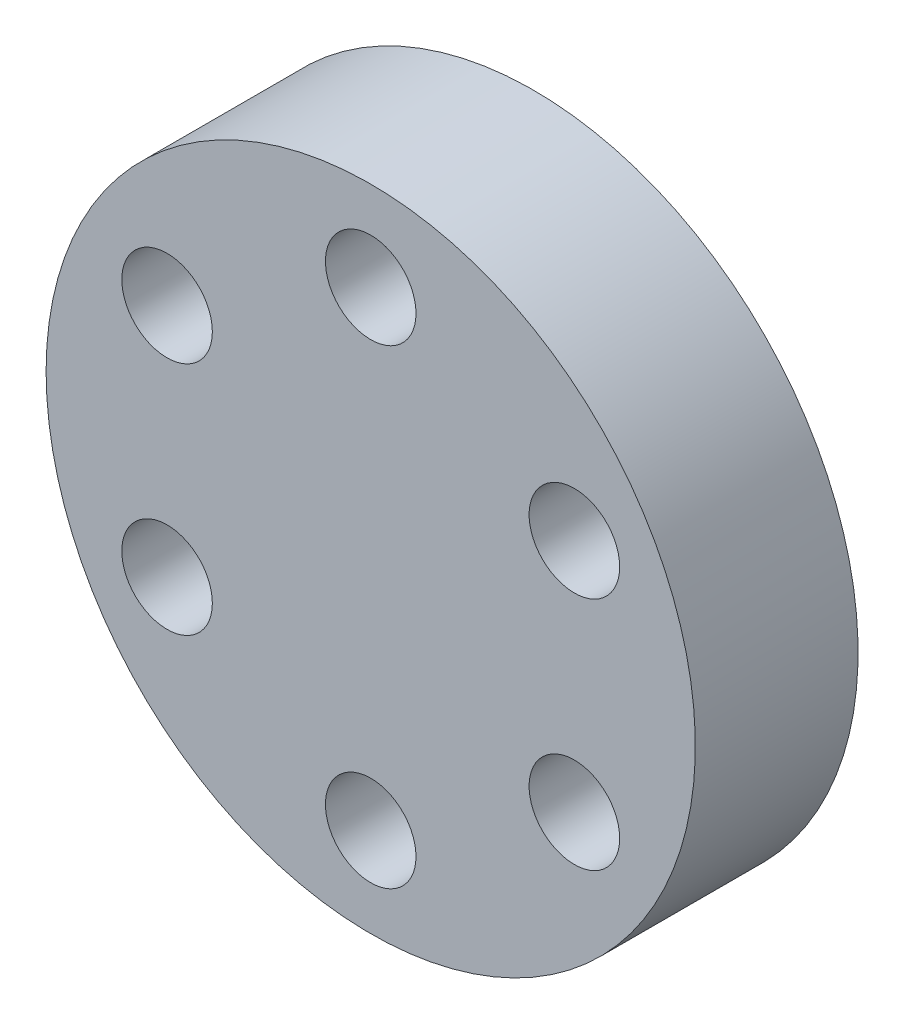
ISO-10303-21;
HEADER;
FILE_DESCRIPTION(('STEP AP214'),'2;1');
FILE_NAME('part.step','',(''),(''),'','','');
FILE_SCHEMA(('AUTOMOTIVE_DESIGN { 1 0 10303 214 1 1 1 1 }'));
ENDSEC;
DATA;
#1=APPLICATION_CONTEXT('core data for automotive mechanical design processes');
#2=APPLICATION_PROTOCOL_DEFINITION('international standard','automotive_design',2000,#1);
#3=PRODUCT_CONTEXT('',#1,'mechanical');
#4=PRODUCT('Part','Part','',(#3));
#5=PRODUCT_RELATED_PRODUCT_CATEGORY('part','',(#4));
#6=PRODUCT_DEFINITION_FORMATION('','',#4);
#7=PRODUCT_DEFINITION_CONTEXT('part definition',#1,'design');
#8=PRODUCT_DEFINITION('design','',#6,#7);
#9=PRODUCT_DEFINITION_SHAPE('','',#8);
#10=(LENGTH_UNIT() NAMED_UNIT(*) SI_UNIT(.MILLI.,.METRE.));
#11=(NAMED_UNIT(*) PLANE_ANGLE_UNIT() SI_UNIT($,.RADIAN.));
#12=(NAMED_UNIT(*) SI_UNIT($,.STERADIAN.) SOLID_ANGLE_UNIT());
#13=UNCERTAINTY_MEASURE_WITH_UNIT(LENGTH_MEASURE(1.E-05),#10,'distance_accuracy_value','');
#14=(GEOMETRIC_REPRESENTATION_CONTEXT(3) GLOBAL_UNCERTAINTY_ASSIGNED_CONTEXT((#13)) GLOBAL_UNIT_ASSIGNED_CONTEXT((#10,
#11,#12)) REPRESENTATION_CONTEXT('',''));
#15=CARTESIAN_POINT('',(0.,0.,0.));
#16=DIRECTION('',(0.,0.,1.));
#17=DIRECTION('',(1.,0.,0.));
#18=AXIS2_PLACEMENT_3D('',#15,#16,#17);
#19=CARTESIAN_POINT('',(0.,0.,9.525));
#20=DIRECTION('',(0.,0.,-1.));
#21=DIRECTION('',(-1.,0.,0.));
#22=AXIS2_PLACEMENT_3D('',#19,#20,#21);
#23=CYLINDRICAL_SURFACE('',#22,19.);
#24=CARTESIAN_POINT('',(0.,0.,9.525));
#25=DIRECTION('',(0.,0.,1.));
#26=DIRECTION('',(1.,0.,0.));
#27=AXIS2_PLACEMENT_3D('',#24,#25,#26);
#28=CIRCLE('',#27,19.);
#29=CARTESIAN_POINT('',(-19.,0.,9.525));
#30=VERTEX_POINT('',#29);
#31=EDGE_CURVE('E10',#30,#30,#28,.T.);
#32=CARTESIAN_POINT('',(0.,0.,0.));
#33=DIRECTION('',(0.,0.,1.));
#34=DIRECTION('',(1.,0.,0.));
#35=AXIS2_PLACEMENT_3D('',#32,#33,#34);
#36=CIRCLE('',#35,19.);
#37=CARTESIAN_POINT('',(-19.,0.,0.));
#38=VERTEX_POINT('',#37);
#39=EDGE_CURVE('E46',#38,#38,#36,.T.);
#40=CARTESIAN_POINT('',(-19.,0.,9.525));
#41=CARTESIAN_POINT('',(-19.,0.,9.42578125));
#42=CARTESIAN_POINT('',(-19.,0.,9.3265625));
#43=CARTESIAN_POINT('',(-19.,0.,9.128125));
#44=CARTESIAN_POINT('',(-19.,0.,9.02890625));
#45=CARTESIAN_POINT('',(-19.,0.,8.83046875));
#46=CARTESIAN_POINT('',(-19.,0.,8.73125));
#47=CARTESIAN_POINT('',(-19.,0.,8.5328125));
#48=CARTESIAN_POINT('',(-19.,0.,8.43359375));
#49=CARTESIAN_POINT('',(-19.,0.,8.23515625));
#50=CARTESIAN_POINT('',(-19.,0.,8.1359375));
#51=CARTESIAN_POINT('',(-19.,0.,7.9375));
#52=CARTESIAN_POINT('',(-19.,0.,7.83828125));
#53=CARTESIAN_POINT('',(-19.,0.,7.63984375));
#54=CARTESIAN_POINT('',(-19.,0.,7.540625));
#55=CARTESIAN_POINT('',(-19.,0.,7.3421875));
#56=CARTESIAN_POINT('',(-19.,0.,7.24296875));
#57=CARTESIAN_POINT('',(-19.,0.,7.04453125));
#58=CARTESIAN_POINT('',(-19.,0.,6.9453125));
#59=CARTESIAN_POINT('',(-19.,0.,6.746875));
#60=CARTESIAN_POINT('',(-19.,0.,6.64765625));
#61=CARTESIAN_POINT('',(-19.,0.,6.44921875));
#62=CARTESIAN_POINT('',(-19.,0.,6.35));
#63=CARTESIAN_POINT('',(-19.,0.,6.1515625));
#64=CARTESIAN_POINT('',(-19.,0.,6.05234375));
#65=CARTESIAN_POINT('',(-19.,0.,5.85390625));
#66=CARTESIAN_POINT('',(-19.,0.,5.7546875));
#67=CARTESIAN_POINT('',(-19.,0.,5.55625));
#68=CARTESIAN_POINT('',(-19.,0.,5.45703125));
#69=CARTESIAN_POINT('',(-19.,0.,5.25859375));
#70=CARTESIAN_POINT('',(-19.,0.,5.159375));
#71=CARTESIAN_POINT('',(-19.,0.,4.9609375));
#72=CARTESIAN_POINT('',(-19.,0.,4.86171875));
#73=CARTESIAN_POINT('',(-19.,0.,4.66328125));
#74=CARTESIAN_POINT('',(-19.,0.,4.5640625));
#75=CARTESIAN_POINT('',(-19.,0.,4.365625));
#76=CARTESIAN_POINT('',(-19.,0.,4.26640625));
#77=CARTESIAN_POINT('',(-19.,0.,4.06796875));
#78=CARTESIAN_POINT('',(-19.,0.,3.96875));
#79=CARTESIAN_POINT('',(-19.,0.,3.7703125));
#80=CARTESIAN_POINT('',(-19.,0.,3.67109375));
#81=CARTESIAN_POINT('',(-19.,0.,3.47265625));
#82=CARTESIAN_POINT('',(-19.,0.,3.3734375));
#83=CARTESIAN_POINT('',(-19.,0.,3.175));
#84=CARTESIAN_POINT('',(-19.,0.,3.07578125));
#85=CARTESIAN_POINT('',(-19.,0.,2.87734375));
#86=CARTESIAN_POINT('',(-19.,0.,2.778125));
#87=CARTESIAN_POINT('',(-19.,0.,2.5796875));
#88=CARTESIAN_POINT('',(-19.,0.,2.48046875));
#89=CARTESIAN_POINT('',(-19.,0.,2.28203125));
#90=CARTESIAN_POINT('',(-19.,0.,2.1828125));
#91=CARTESIAN_POINT('',(-19.,0.,1.984375));
#92=CARTESIAN_POINT('',(-19.,0.,1.88515625));
#93=CARTESIAN_POINT('',(-19.,0.,1.68671875));
#94=CARTESIAN_POINT('',(-19.,0.,1.5875));
#95=CARTESIAN_POINT('',(-19.,0.,1.3890625));
#96=CARTESIAN_POINT('',(-19.,0.,1.28984375));
#97=CARTESIAN_POINT('',(-19.,0.,1.09140625));
#98=CARTESIAN_POINT('',(-19.,0.,0.992187500000001));
#99=CARTESIAN_POINT('',(-19.,0.,0.793750000000001));
#100=CARTESIAN_POINT('',(-19.,0.,0.69453125));
#101=CARTESIAN_POINT('',(-19.,0.,0.49609375));
#102=CARTESIAN_POINT('',(-19.,0.,0.396875));
#103=CARTESIAN_POINT('',(-19.,0.,0.1984375));
#104=CARTESIAN_POINT('',(-19.,0.,0.0992187500000001));
#105=CARTESIAN_POINT('',(-19.,0.,0.));
#106=B_SPLINE_CURVE_WITH_KNOTS('',3,(#40,#41,#42,#43,#44,#45,#46,#47,#48,#49,#50,#51,#52,#53,
#54,#55,#56,#57,#58,#59,#60,#61,#62,#63,#64,#65,#66,#67,#68,#69,#70,#71,#72,#73,#74,#75,#76,#77,
#78,#79,#80,#81,#82,#83,#84,#85,#86,#87,#88,#89,#90,#91,#92,#93,#94,#95,#96,#97,#98,#99,#100,
#101,#102,#103,#104,#105),.UNSPECIFIED.,.F.,.F.,(4,2,2,2,2,2,2,2,2,2,2,2,2,2,2,2,2,2,2,2,2,2,2,
2,2,2,2,2,2,2,2,2,4),(0.,0.29765625,0.5953125,0.892968750000001,1.190625,1.48828125,1.7859375,
2.08359375,2.38125,2.67890625,2.9765625,3.27421875,3.571875,3.86953125,4.1671875,4.46484375,
4.7625,5.06015625,5.3578125,5.65546875,5.953125,6.25078125,6.5484375,6.84609375,7.14375,
7.44140625,7.7390625,8.03671875,8.334375,8.63203125,8.9296875,9.22734375,9.525),.UNSPECIFIED.);
#107=EDGE_CURVE('BSEAM43',#30,#38,#106,.T.);
#108=ORIENTED_EDGE('',*,*,#31,.F.);
#109=ORIENTED_EDGE('',*,*,#39,.T.);
#110=ORIENTED_EDGE('',*,*,#107,.T.);
#111=ORIENTED_EDGE('',*,*,#107,.F.);
#112=EDGE_LOOP('',(#108,#110,#109,#111));
#113=FACE_BOUND('',#112,.T.);
#114=ADVANCED_FACE('F43',(#113),#23,.T.);
#115=CARTESIAN_POINT('',(0.,0.,9.525));
#116=DIRECTION('',(0.,0.,1.));
#117=DIRECTION('',(1.,0.,0.));
#118=AXIS2_PLACEMENT_3D('',#115,#116,#117);
#119=PLANE('',#118);
#120=CARTESIAN_POINT('',(0.,13.7637896242771,9.525));
#121=DIRECTION('',(0.,0.,1.));
#122=DIRECTION('',(1.,0.,0.));
#123=AXIS2_PLACEMENT_3D('',#120,#121,#122);
#124=CIRCLE('',#123,2.64999999999999);
#125=CARTESIAN_POINT('',(2.64999999999999,13.7637896242771,9.525));
#126=VERTEX_POINT('',#125);
#127=EDGE_CURVE('E100',#126,#126,#124,.T.);
#128=ORIENTED_EDGE('',*,*,#127,.F.);
#129=EDGE_LOOP('',(#128));
#130=FACE_BOUND('',#129,.T.);
#131=CARTESIAN_POINT('',(11.9197914669691,6.88189481213925,9.525));
#132=DIRECTION('',(0.,0.,1.));
#133=DIRECTION('',(1.,0.,0.));
#134=AXIS2_PLACEMENT_3D('',#131,#132,#133);
#135=CIRCLE('',#134,2.64999999999999);
#136=CARTESIAN_POINT('',(14.5697914669691,6.88189481213925,9.525));
#137=VERTEX_POINT('',#136);
#138=EDGE_CURVE('E92',#137,#137,#135,.T.);
#139=ORIENTED_EDGE('',*,*,#138,.F.);
#140=EDGE_LOOP('',(#139));
#141=FACE_BOUND('',#140,.T.);
#142=CARTESIAN_POINT('',(11.9197914669699,-6.88189481213789,9.525));
#143=DIRECTION('',(0.,0.,1.));
#144=DIRECTION('',(1.,0.,0.));
#145=AXIS2_PLACEMENT_3D('',#142,#143,#144);
#146=CIRCLE('',#145,2.64999999999999);
#147=CARTESIAN_POINT('',(14.5697914669698,-6.88189481213789,9.525));
#148=VERTEX_POINT('',#147);
#149=EDGE_CURVE('E84',#148,#148,#146,.T.);
#150=ORIENTED_EDGE('',*,*,#149,.F.);
#151=EDGE_LOOP('',(#150));
#152=FACE_BOUND('',#151,.T.);
#153=CARTESIAN_POINT('',(1.55970498317741E-12,-13.7637896242771,9.525));
#154=DIRECTION('',(0.,0.,1.));
#155=DIRECTION('',(1.,0.,0.));
#156=AXIS2_PLACEMENT_3D('',#153,#154,#155);
#157=CIRCLE('',#156,2.64999999999999);
#158=CARTESIAN_POINT('',(2.65000000000155,-13.7637896242771,9.525));
#159=VERTEX_POINT('',#158);
#160=EDGE_CURVE('E76',#159,#159,#157,.T.);
#161=ORIENTED_EDGE('',*,*,#160,.F.);
#162=EDGE_LOOP('',(#161));
#163=FACE_BOUND('',#162,.T.);
#164=CARTESIAN_POINT('',(-11.9197914669675,-6.88189481213925,9.525));
#165=DIRECTION('',(0.,0.,1.));
#166=DIRECTION('',(1.,0.,0.));
#167=AXIS2_PLACEMENT_3D('',#164,#165,#166);
#168=CIRCLE('',#167,2.64999999999999);
#169=CARTESIAN_POINT('',(-9.26979146696752,-6.88189481213925,9.525));
#170=VERTEX_POINT('',#169);
#171=EDGE_CURVE('E68',#170,#170,#168,.T.);
#172=ORIENTED_EDGE('',*,*,#171,.F.);
#173=EDGE_LOOP('',(#172));
#174=FACE_BOUND('',#173,.T.);
#175=CARTESIAN_POINT('',(-11.9197914669683,6.8818948121379,9.525));
#176=DIRECTION('',(0.,0.,1.));
#177=DIRECTION('',(1.,0.,0.));
#178=AXIS2_PLACEMENT_3D('',#175,#176,#177);
#179=CIRCLE('',#178,2.64999999999999);
#180=CARTESIAN_POINT('',(-9.2697914669683,6.8818948121379,9.525));
#181=VERTEX_POINT('',#180);
#182=EDGE_CURVE('E60',#181,#181,#179,.T.);
#183=ORIENTED_EDGE('',*,*,#182,.F.);
#184=EDGE_LOOP('',(#183));
#185=FACE_BOUND('',#184,.T.);
#186=ORIENTED_EDGE('',*,*,#31,.T.);
#187=EDGE_LOOP('',(#186));
#188=FACE_BOUND('',#187,.T.);
#189=ADVANCED_FACE('F107',(#130,#141,#152,#163,#174,#185,#188),#119,.T.);
#190=CARTESIAN_POINT('',(0.,0.,0.));
#191=DIRECTION('',(0.,0.,1.));
#192=DIRECTION('',(1.,0.,0.));
#193=AXIS2_PLACEMENT_3D('',#190,#191,#192);
#194=PLANE('',#193);
#195=CARTESIAN_POINT('',(0.,13.7637896242771,0.));
#196=DIRECTION('',(0.,0.,1.));
#197=DIRECTION('',(1.,0.,0.));
#198=AXIS2_PLACEMENT_3D('',#195,#196,#197);
#199=CIRCLE('',#198,2.65);
#200=CARTESIAN_POINT('',(2.65,13.7637896242771,0.));
#201=VERTEX_POINT('',#200);
#202=EDGE_CURVE('E96',#201,#201,#199,.T.);
#203=ORIENTED_EDGE('',*,*,#202,.T.);
#204=EDGE_LOOP('',(#203));
#205=FACE_BOUND('',#204,.T.);
#206=CARTESIAN_POINT('',(11.9197914669691,6.88189481213925,0.));
#207=DIRECTION('',(0.,0.,1.));
#208=DIRECTION('',(1.,0.,0.));
#209=AXIS2_PLACEMENT_3D('',#206,#207,#208);
#210=CIRCLE('',#209,2.65);
#211=CARTESIAN_POINT('',(14.5697914669691,6.88189481213925,0.));
#212=VERTEX_POINT('',#211);
#213=EDGE_CURVE('E88',#212,#212,#210,.T.);
#214=ORIENTED_EDGE('',*,*,#213,.T.);
#215=EDGE_LOOP('',(#214));
#216=FACE_BOUND('',#215,.T.);
#217=CARTESIAN_POINT('',(11.9197914669699,-6.88189481213789,0.));
#218=DIRECTION('',(0.,0.,1.));
#219=DIRECTION('',(1.,0.,0.));
#220=AXIS2_PLACEMENT_3D('',#217,#218,#219);
#221=CIRCLE('',#220,2.65);
#222=CARTESIAN_POINT('',(14.5697914669698,-6.88189481213789,0.));
#223=VERTEX_POINT('',#222);
#224=EDGE_CURVE('E80',#223,#223,#221,.T.);
#225=ORIENTED_EDGE('',*,*,#224,.T.);
#226=EDGE_LOOP('',(#225));
#227=FACE_BOUND('',#226,.T.);
#228=CARTESIAN_POINT('',(1.55970498317741E-12,-13.7637896242771,0.));
#229=DIRECTION('',(0.,0.,1.));
#230=DIRECTION('',(1.,0.,0.));
#231=AXIS2_PLACEMENT_3D('',#228,#229,#230);
#232=CIRCLE('',#231,2.65);
#233=CARTESIAN_POINT('',(2.65000000000156,-13.7637896242771,0.));
#234=VERTEX_POINT('',#233);
#235=EDGE_CURVE('E72',#234,#234,#232,.T.);
#236=ORIENTED_EDGE('',*,*,#235,.T.);
#237=EDGE_LOOP('',(#236));
#238=FACE_BOUND('',#237,.T.);
#239=CARTESIAN_POINT('',(-11.9197914669675,-6.88189481213925,0.));
#240=DIRECTION('',(0.,0.,1.));
#241=DIRECTION('',(1.,0.,0.));
#242=AXIS2_PLACEMENT_3D('',#239,#240,#241);
#243=CIRCLE('',#242,2.65);
#244=CARTESIAN_POINT('',(-9.26979146696751,-6.88189481213925,0.));
#245=VERTEX_POINT('',#244);
#246=EDGE_CURVE('E64',#245,#245,#243,.T.);
#247=ORIENTED_EDGE('',*,*,#246,.T.);
#248=EDGE_LOOP('',(#247));
#249=FACE_BOUND('',#248,.T.);
#250=CARTESIAN_POINT('',(-11.9197914669683,6.8818948121379,0.));
#251=DIRECTION('',(0.,0.,1.));
#252=DIRECTION('',(1.,0.,0.));
#253=AXIS2_PLACEMENT_3D('',#250,#251,#252);
#254=CIRCLE('',#253,2.65);
#255=CARTESIAN_POINT('',(-9.26979146696829,6.8818948121379,0.));
#256=VERTEX_POINT('',#255);
#257=EDGE_CURVE('E55',#256,#256,#254,.T.);
#258=ORIENTED_EDGE('',*,*,#257,.T.);
#259=EDGE_LOOP('',(#258));
#260=FACE_BOUND('',#259,.T.);
#261=ORIENTED_EDGE('',*,*,#39,.F.);
#262=EDGE_LOOP('',(#261));
#263=FACE_BOUND('',#262,.T.);
#264=ADVANCED_FACE('F110',(#205,#216,#227,#238,#249,#260,#263),#194,.F.);
#265=CARTESIAN_POINT('',(-11.9197914669683,6.8818948121379,9.525));
#266=DIRECTION('',(0.,0.,1.));
#267=DIRECTION('',(1.,0.,0.));
#268=AXIS2_PLACEMENT_3D('',#265,#266,#267);
#269=CYLINDRICAL_SURFACE('',#268,2.64999999999999);
#270=ORIENTED_EDGE('',*,*,#257,.F.);
#271=EDGE_LOOP('',(#270));
#272=FACE_BOUND('',#271,.T.);
#273=ORIENTED_EDGE('',*,*,#182,.T.);
#274=EDGE_LOOP('',(#273));
#275=FACE_BOUND('',#274,.T.);
#276=ADVANCED_FACE('F122',(#272,#275),#269,.F.);
#277=CARTESIAN_POINT('',(-11.9197914669675,-6.88189481213925,9.525));
#278=DIRECTION('',(0.,0.,1.));
#279=DIRECTION('',(1.,0.,0.));
#280=AXIS2_PLACEMENT_3D('',#277,#278,#279);
#281=CYLINDRICAL_SURFACE('',#280,2.64999999999999);
#282=ORIENTED_EDGE('',*,*,#246,.F.);
#283=EDGE_LOOP('',(#282));
#284=FACE_BOUND('',#283,.T.);
#285=ORIENTED_EDGE('',*,*,#171,.T.);
#286=EDGE_LOOP('',(#285));
#287=FACE_BOUND('',#286,.T.);
#288=ADVANCED_FACE('F124',(#284,#287),#281,.F.);
#289=CARTESIAN_POINT('',(1.55970498317741E-12,-13.7637896242771,9.525));
#290=DIRECTION('',(0.,0.,1.));
#291=DIRECTION('',(1.,0.,0.));
#292=AXIS2_PLACEMENT_3D('',#289,#290,#291);
#293=CYLINDRICAL_SURFACE('',#292,2.64999999999999);
#294=ORIENTED_EDGE('',*,*,#235,.F.);
#295=EDGE_LOOP('',(#294));
#296=FACE_BOUND('',#295,.T.);
#297=ORIENTED_EDGE('',*,*,#160,.T.);
#298=EDGE_LOOP('',(#297));
#299=FACE_BOUND('',#298,.T.);
#300=ADVANCED_FACE('F131',(#296,#299),#293,.F.);
#301=CARTESIAN_POINT('',(11.9197914669699,-6.88189481213789,9.525));
#302=DIRECTION('',(0.,0.,1.));
#303=DIRECTION('',(1.,0.,0.));
#304=AXIS2_PLACEMENT_3D('',#301,#302,#303);
#305=CYLINDRICAL_SURFACE('',#304,2.64999999999999);
#306=ORIENTED_EDGE('',*,*,#224,.F.);
#307=EDGE_LOOP('',(#306));
#308=FACE_BOUND('',#307,.T.);
#309=ORIENTED_EDGE('',*,*,#149,.T.);
#310=EDGE_LOOP('',(#309));
#311=FACE_BOUND('',#310,.T.);
#312=ADVANCED_FACE('F173',(#308,#311),#305,.F.);
#313=CARTESIAN_POINT('',(11.9197914669691,6.88189481213925,9.525));
#314=DIRECTION('',(0.,0.,1.));
#315=DIRECTION('',(1.,0.,0.));
#316=AXIS2_PLACEMENT_3D('',#313,#314,#315);
#317=CYLINDRICAL_SURFACE('',#316,2.64999999999999);
#318=ORIENTED_EDGE('',*,*,#213,.F.);
#319=EDGE_LOOP('',(#318));
#320=FACE_BOUND('',#319,.T.);
#321=ORIENTED_EDGE('',*,*,#138,.T.);
#322=EDGE_LOOP('',(#321));
#323=FACE_BOUND('',#322,.T.);
#324=ADVANCED_FACE('F183',(#320,#323),#317,.F.);
#325=CARTESIAN_POINT('',(0.,13.7637896242771,9.525));
#326=DIRECTION('',(0.,0.,1.));
#327=DIRECTION('',(1.,0.,0.));
#328=AXIS2_PLACEMENT_3D('',#325,#326,#327);
#329=CYLINDRICAL_SURFACE('',#328,2.64999999999999);
#330=ORIENTED_EDGE('',*,*,#202,.F.);
#331=EDGE_LOOP('',(#330));
#332=FACE_BOUND('',#331,.T.);
#333=ORIENTED_EDGE('',*,*,#127,.T.);
#334=EDGE_LOOP('',(#333));
#335=FACE_BOUND('',#334,.T.);
#336=ADVANCED_FACE('F105',(#332,#335),#329,.F.);
#337=CLOSED_SHELL('',(#114,#189,#264,#276,#288,#300,#312,#324,#336));
#338=MANIFOLD_SOLID_BREP('B2',#337);
#339=ADVANCED_BREP_SHAPE_REPRESENTATION('',(#18,#338),#14);
#340=SHAPE_DEFINITION_REPRESENTATION(#9,#339);
ENDSEC;
END-ISO-10303-21;
